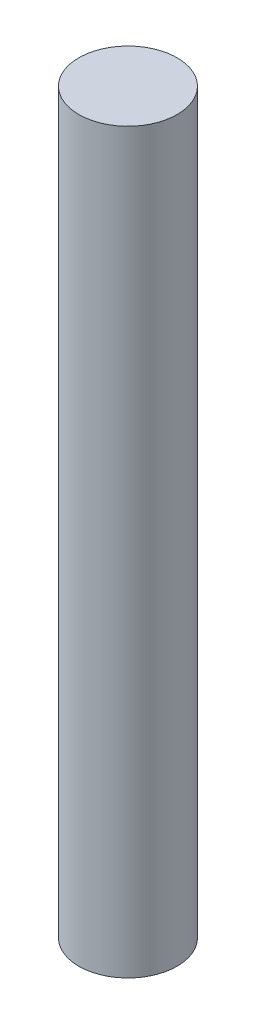
ISO-10303-21;
HEADER;
FILE_DESCRIPTION(('STEP AP214'),'2;1');
FILE_NAME('part.step','',(''),(''),'','','');
FILE_SCHEMA(('AUTOMOTIVE_DESIGN { 1 0 10303 214 1 1 1 1 }'));
ENDSEC;
DATA;
#1=APPLICATION_CONTEXT('core data for automotive mechanical design processes');
#2=APPLICATION_PROTOCOL_DEFINITION('international standard','automotive_design',2000,#1);
#3=PRODUCT_CONTEXT('',#1,'mechanical');
#4=PRODUCT('Part','Part','',(#3));
#5=PRODUCT_RELATED_PRODUCT_CATEGORY('part','',(#4));
#6=PRODUCT_DEFINITION_FORMATION('','',#4);
#7=PRODUCT_DEFINITION_CONTEXT('part definition',#1,'design');
#8=PRODUCT_DEFINITION('design','',#6,#7);
#9=PRODUCT_DEFINITION_SHAPE('','',#8);
#10=(LENGTH_UNIT() NAMED_UNIT(*) SI_UNIT(.MILLI.,.METRE.));
#11=(NAMED_UNIT(*) PLANE_ANGLE_UNIT() SI_UNIT($,.RADIAN.));
#12=(NAMED_UNIT(*) SI_UNIT($,.STERADIAN.) SOLID_ANGLE_UNIT());
#13=UNCERTAINTY_MEASURE_WITH_UNIT(LENGTH_MEASURE(1.E-05),#10,'distance_accuracy_value','');
#14=(GEOMETRIC_REPRESENTATION_CONTEXT(3) GLOBAL_UNCERTAINTY_ASSIGNED_CONTEXT((#13)) GLOBAL_UNIT_ASSIGNED_CONTEXT((#10,
#11,#12)) REPRESENTATION_CONTEXT('',''));
#15=CARTESIAN_POINT('',(0.,0.,0.));
#16=DIRECTION('',(0.,0.,1.));
#17=DIRECTION('',(1.,0.,0.));
#18=AXIS2_PLACEMENT_3D('',#15,#16,#17);
#19=CARTESIAN_POINT('',(0.,9.,0.));
#20=DIRECTION('',(0.,-1.,0.));
#21=DIRECTION('',(0.,0.,-1.));
#22=AXIS2_PLACEMENT_3D('',#19,#20,#21);
#23=CYLINDRICAL_SURFACE('',#22,0.6);
#24=CARTESIAN_POINT('',(0.,9.,0.));
#25=DIRECTION('',(0.,1.,0.));
#26=DIRECTION('',(0.,0.,1.));
#27=AXIS2_PLACEMENT_3D('',#24,#25,#26);
#28=CIRCLE('',#27,0.6);
#29=CARTESIAN_POINT('',(0.,9.,0.6));
#30=VERTEX_POINT('',#29);
#31=EDGE_CURVE('E10',#30,#30,#28,.T.);
#32=ORIENTED_EDGE('',*,*,#31,.F.);
#33=EDGE_LOOP('',(#32));
#34=FACE_BOUND('',#33,.T.);
#35=CARTESIAN_POINT('',(0.,0.,0.));
#36=DIRECTION('',(0.,1.,0.));
#37=DIRECTION('',(0.,0.,1.));
#38=AXIS2_PLACEMENT_3D('',#35,#36,#37);
#39=CIRCLE('',#38,0.6);
#40=CARTESIAN_POINT('',(0.,0.,0.6));
#41=VERTEX_POINT('',#40);
#42=EDGE_CURVE('E38',#41,#41,#39,.T.);
#43=ORIENTED_EDGE('',*,*,#42,.T.);
#44=EDGE_LOOP('',(#43));
#45=FACE_BOUND('',#44,.T.);
#46=ADVANCED_FACE('F35',(#34,#45),#23,.T.);
#47=CARTESIAN_POINT('',(0.,9.,0.));
#48=DIRECTION('',(0.,1.,0.));
#49=DIRECTION('',(0.,0.,1.));
#50=AXIS2_PLACEMENT_3D('',#47,#48,#49);
#51=PLANE('',#50);
#52=ORIENTED_EDGE('',*,*,#31,.T.);
#53=EDGE_LOOP('',(#52));
#54=FACE_BOUND('',#53,.T.);
#55=ADVANCED_FACE('F50',(#54),#51,.T.);
#56=CARTESIAN_POINT('',(0.,0.,0.));
#57=DIRECTION('',(0.,1.,0.));
#58=DIRECTION('',(0.,0.,1.));
#59=AXIS2_PLACEMENT_3D('',#56,#57,#58);
#60=PLANE('',#59);
#61=ORIENTED_EDGE('',*,*,#42,.F.);
#62=EDGE_LOOP('',(#61));
#63=FACE_BOUND('',#62,.T.);
#64=ADVANCED_FACE('F48',(#63),#60,.F.);
#65=CLOSED_SHELL('',(#46,#55,#64));
#66=MANIFOLD_SOLID_BREP('B2',#65);
#67=ADVANCED_BREP_SHAPE_REPRESENTATION('',(#18,#66),#14);
#68=SHAPE_DEFINITION_REPRESENTATION(#9,#67);
ENDSEC;
END-ISO-10303-21;
